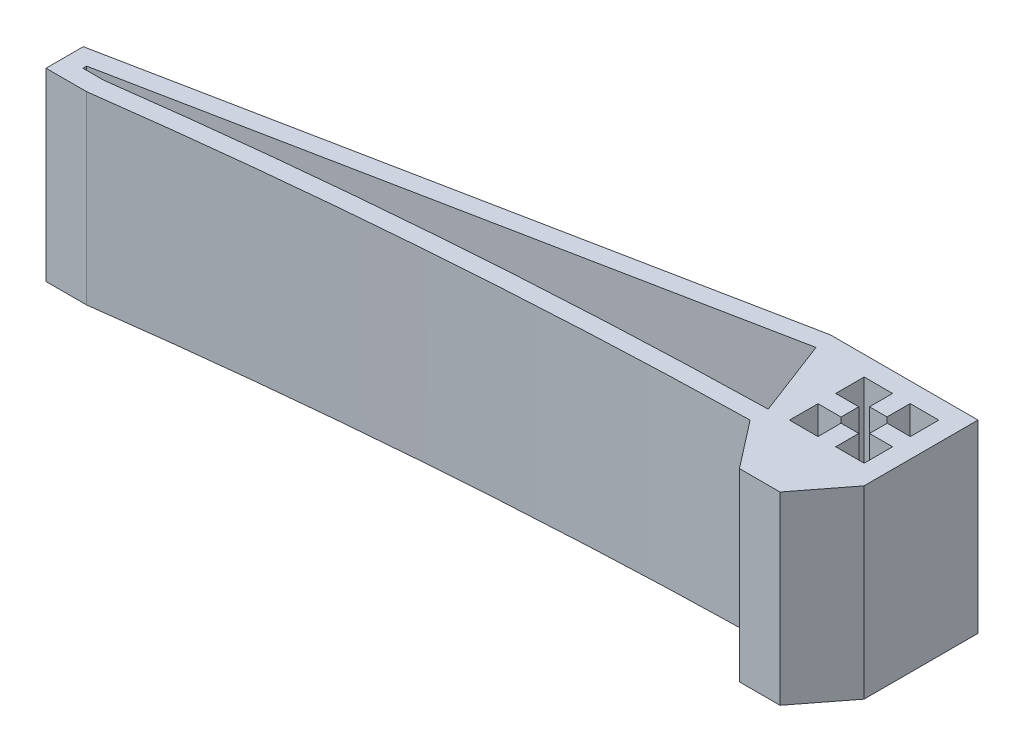
ISO-10303-21;
HEADER;
FILE_DESCRIPTION(('STEP AP214'),'2;1');
FILE_NAME('part.step','',(''),(''),'','','');
FILE_SCHEMA(('AUTOMOTIVE_DESIGN { 1 0 10303 214 1 1 1 1 }'));
ENDSEC;
DATA;
#1=APPLICATION_CONTEXT('core data for automotive mechanical design processes');
#2=APPLICATION_PROTOCOL_DEFINITION('international standard','automotive_design',2000,#1);
#3=PRODUCT_CONTEXT('',#1,'mechanical');
#4=PRODUCT('Part','Part','',(#3));
#5=PRODUCT_RELATED_PRODUCT_CATEGORY('part','',(#4));
#6=PRODUCT_DEFINITION_FORMATION('','',#4);
#7=PRODUCT_DEFINITION_CONTEXT('part definition',#1,'design');
#8=PRODUCT_DEFINITION('design','',#6,#7);
#9=PRODUCT_DEFINITION_SHAPE('','',#8);
#10=(LENGTH_UNIT() NAMED_UNIT(*) SI_UNIT(.MILLI.,.METRE.));
#11=(NAMED_UNIT(*) PLANE_ANGLE_UNIT() SI_UNIT($,.RADIAN.));
#12=(NAMED_UNIT(*) SI_UNIT($,.STERADIAN.) SOLID_ANGLE_UNIT());
#13=UNCERTAINTY_MEASURE_WITH_UNIT(LENGTH_MEASURE(1.E-05),#10,'distance_accuracy_value','');
#14=(GEOMETRIC_REPRESENTATION_CONTEXT(3) GLOBAL_UNCERTAINTY_ASSIGNED_CONTEXT((#13)) GLOBAL_UNIT_ASSIGNED_CONTEXT((#10,
#11,#12)) REPRESENTATION_CONTEXT('',''));
#15=CARTESIAN_POINT('',(0.,0.,0.));
#16=DIRECTION('',(0.,0.,1.));
#17=DIRECTION('',(1.,0.,0.));
#18=AXIS2_PLACEMENT_3D('',#15,#16,#17);
#19=CARTESIAN_POINT('',(-98.9690705210254,50.,19.4567414902959));
#20=DIRECTION('',(0.,1.,0.));
#21=DIRECTION('',(0.,0.,1.));
#22=AXIS2_PLACEMENT_3D('',#19,#20,#21);
#23=PLANE('',#22);
#24=CARTESIAN_POINT('',(-182.185114876448,50.,28.2346423573872));
#25=CARTESIAN_POINT('',(-99.1360168221978,50.,17.0865950202692));
#26=CARTESIAN_POINT('',(-15.419133563258,50.,15.419133563258));
#27=B_SPLINE_CURVE_WITH_KNOTS('',2,(#24,#25,#26),.UNSPECIFIED.,.F.,.F.,(3,3),(0.,1.),.UNSPECIFIED.);
#28=CARTESIAN_POINT('',(-182.185114876448,50.,28.2346423573872));
#29=VERTEX_POINT('',#28);
#30=CARTESIAN_POINT('',(-15.419133563258,50.,15.419133563258));
#31=VERTEX_POINT('',#30);
#32=EDGE_CURVE('E525',#29,#31,#27,.T.);
#33=ORIENTED_EDGE('',*,*,#32,.T.);
#34=DIRECTION('',(0.612556121082558,0.,0.790427098804368));
#35=VECTOR('',#34,1.);
#36=CARTESIAN_POINT('',(-5.48751764509717,50.,28.2346423573872));
#37=LINE('',#36,#35);
#38=CARTESIAN_POINT('',(-5.48751764509717,50.,28.2346423573872));
#39=VERTEX_POINT('',#38);
#40=EDGE_CURVE('E553',#31,#39,#37,.T.);
#41=ORIENTED_EDGE('',*,*,#40,.T.);
#42=DIRECTION('',(1.,0.,0.));
#43=VECTOR('',#42,1.);
#44=CARTESIAN_POINT('',(-5.48751764509717,50.,28.2346423573872));
#45=LINE('',#44,#43);
#46=CARTESIAN_POINT('',(5.48751764509718,50.,28.2346423573872));
#47=VERTEX_POINT('',#46);
#48=EDGE_CURVE('E504',#39,#47,#45,.T.);
#49=ORIENTED_EDGE('',*,*,#48,.T.);
#50=DIRECTION('',(0.612556121082558,0.,-0.790427098804368));
#51=VECTOR('',#50,1.);
#52=CARTESIAN_POINT('',(5.48751764509718,50.,28.2346423573872));
#53=LINE('',#52,#51);
#54=CARTESIAN_POINT('',(15.419133563258,50.,15.419133563258));
#55=VERTEX_POINT('',#54);
#56=EDGE_CURVE('E547',#47,#55,#53,.T.);
#57=ORIENTED_EDGE('',*,*,#56,.T.);
#58=DIRECTION('',(0.,0.,-1.));
#59=VECTOR('',#58,1.);
#60=CARTESIAN_POINT('',(15.419133563258,50.,15.419133563258));
#61=LINE('',#60,#59);
#62=CARTESIAN_POINT('',(15.419133563258,50.,-15.419133563258));
#63=VERTEX_POINT('',#62);
#64=EDGE_CURVE('E549',#55,#63,#61,.T.);
#65=ORIENTED_EDGE('',*,*,#64,.T.);
#66=DIRECTION('',(-1.,0.,0.));
#67=VECTOR('',#66,1.);
#68=CARTESIAN_POINT('',(15.419133563258,50.,-15.419133563258));
#69=LINE('',#68,#67);
#70=CARTESIAN_POINT('',(-24.494437672455,50.,-15.419133563258));
#71=VERTEX_POINT('',#70);
#72=EDGE_CURVE('E551',#63,#71,#69,.T.);
#73=ORIENTED_EDGE('',*,*,#72,.T.);
#74=DIRECTION('',(-0.980776783618294,0.,0.195133033378142));
#75=VECTOR('',#74,1.);
#76=CARTESIAN_POINT('',(-24.494437672455,50.,-15.419133563258));
#77=LINE('',#76,#75);
#78=CARTESIAN_POINT('',(-193.160150166642,50.,18.1381983960651));
#79=VERTEX_POINT('',#78);
#80=EDGE_CURVE('E558',#71,#79,#77,.T.);
#81=ORIENTED_EDGE('',*,*,#80,.T.);
#82=DIRECTION('',(0.,0.,1.));
#83=VECTOR('',#82,1.);
#84=CARTESIAN_POINT('',(-193.160150166642,50.,28.2346423573872));
#85=LINE('',#84,#83);
#86=CARTESIAN_POINT('',(-193.160150166642,50.,28.2346423573872));
#87=VERTEX_POINT('',#86);
#88=EDGE_CURVE('E560',#79,#87,#85,.T.);
#89=ORIENTED_EDGE('',*,*,#88,.T.);
#90=DIRECTION('',(1.,0.,0.));
#91=VECTOR('',#90,1.);
#92=CARTESIAN_POINT('',(-182.185114876448,50.,28.2346423573872));
#93=LINE('',#92,#91);
#94=EDGE_CURVE('E530',#87,#29,#93,.T.);
#95=ORIENTED_EDGE('',*,*,#94,.T.);
#96=EDGE_LOOP('',(#33,#41,#49,#57,#65,#73,#81,#89,#95));
#97=FACE_BOUND('',#96,.T.);
#98=DIRECTION('',(-0.980776783618293,0.,0.195133033378142));
#99=VECTOR('',#98,1.);
#100=CARTESIAN_POINT('',(-23.5187725055643,50.,-10.5152496451666));
#101=LINE('',#100,#99);
#102=CARTESIAN_POINT('',(-23.5187725055643,50.,-10.5152496451666));
#103=VERTEX_POINT('',#102);
#104=CARTESIAN_POINT('',(-188.160150166642,50.,22.2414101567093));
#105=VERTEX_POINT('',#104);
#106=EDGE_CURVE('E408',#103,#105,#101,.T.);
#107=ORIENTED_EDGE('',*,*,#106,.F.);
#108=DIRECTION('',(-0.356957116026224,0.,-0.934120772340622));
#109=VECTOR('',#108,1.);
#110=CARTESIAN_POINT('',(-15.5187031322485,50.,10.4201250714738));
#111=LINE('',#110,#109);
#112=CARTESIAN_POINT('',(-15.5187031322485,50.,10.4201250714738));
#113=VERTEX_POINT('',#112);
#114=EDGE_CURVE('E406',#113,#103,#111,.T.);
#115=ORIENTED_EDGE('',*,*,#114,.F.);
#116=CARTESIAN_POINT('',(-182.518919813248,50.,23.2346423573951));
#117=CARTESIAN_POINT('',(-99.352804625768,50.,12.0899455037888));
#118=CARTESIAN_POINT('',(-15.5187031322485,50.,10.4201250714738));
#119=B_SPLINE_CURVE_WITH_KNOTS('',2,(#116,#117,#118),.UNSPECIFIED.,.F.,.F.,(3,3),
(0.00198847837220901,1.),.UNSPECIFIED.);
#120=CARTESIAN_POINT('',(-182.518919813248,50.,23.2346423573951));
#121=VERTEX_POINT('',#120);
#122=EDGE_CURVE('E416',#121,#113,#119,.T.);
#123=ORIENTED_EDGE('',*,*,#122,.F.);
#124=DIRECTION('',(1.,0.,1.3979313780451E-12));
#125=VECTOR('',#124,1.);
#126=CARTESIAN_POINT('',(-182.518919813248,50.,23.2346423573951));
#127=LINE('',#126,#125);
#128=CARTESIAN_POINT('',(-188.160150166642,50.,23.2346423573872));
#129=VERTEX_POINT('',#128);
#130=EDGE_CURVE('E413',#129,#121,#127,.T.);
#131=ORIENTED_EDGE('',*,*,#130,.F.);
#132=DIRECTION('',(0.,0.,1.));
#133=VECTOR('',#132,1.);
#134=CARTESIAN_POINT('',(-188.160150166642,50.,23.2346423573872));
#135=LINE('',#134,#133);
#136=EDGE_CURVE('E411',#105,#129,#135,.T.);
#137=ORIENTED_EDGE('',*,*,#136,.F.);
#138=EDGE_LOOP('',(#107,#115,#123,#131,#137));
#139=FACE_BOUND('',#138,.T.);
#140=DIRECTION('',(1.,0.,0.));
#141=VECTOR('',#140,1.);
#142=CARTESIAN_POINT('',(-10.0735773270664,50.,-2.4));
#143=LINE('',#142,#141);
#144=CARTESIAN_POINT('',(-10.0735773270664,50.,-2.4));
#145=VERTEX_POINT('',#144);
#146=CARTESIAN_POINT('',(-3.82357732706653,50.,-2.4));
#147=VERTEX_POINT('',#146);
#148=EDGE_CURVE('E265',#145,#147,#143,.T.);
#149=ORIENTED_EDGE('',*,*,#148,.F.);
#150=DIRECTION('',(0.,0.,1.));
#151=VECTOR('',#150,1.);
#152=CARTESIAN_POINT('',(-10.0735773270664,50.,-2.4));
#153=LINE('',#152,#151);
#154=CARTESIAN_POINT('',(-10.0735773270664,50.,-10.0999999999999));
#155=VERTEX_POINT('',#154);
#156=EDGE_CURVE('E257',#155,#145,#153,.T.);
#157=ORIENTED_EDGE('',*,*,#156,.F.);
#158=DIRECTION('',(-1.,0.,0.));
#159=VECTOR('',#158,1.);
#160=CARTESIAN_POINT('',(-10.0735773270664,50.,-10.0999999999999));
#161=LINE('',#160,#159);
#162=CARTESIAN_POINT('',(-2.37357732706651,50.,-10.0999999999999));
#163=VERTEX_POINT('',#162);
#164=EDGE_CURVE('E314',#163,#155,#161,.T.);
#165=ORIENTED_EDGE('',*,*,#164,.F.);
#166=DIRECTION('',(0.,0.,-1.));
#167=VECTOR('',#166,1.);
#168=CARTESIAN_POINT('',(-2.37357732706652,50.,-10.0999999999999));
#169=LINE('',#168,#167);
#170=CARTESIAN_POINT('',(-2.37357732706652,50.,-3.85));
#171=VERTEX_POINT('',#170);
#172=EDGE_CURVE('E312',#171,#163,#169,.T.);
#173=ORIENTED_EDGE('',*,*,#172,.F.);
#174=DIRECTION('',(-1.,0.,0.));
#175=VECTOR('',#174,1.);
#176=CARTESIAN_POINT('',(-2.37357732706652,50.,-3.85));
#177=LINE('',#176,#175);
#178=CARTESIAN_POINT('',(2.37357732706652,50.,-3.85));
#179=VERTEX_POINT('',#178);
#180=EDGE_CURVE('E310',#179,#171,#177,.T.);
#181=ORIENTED_EDGE('',*,*,#180,.F.);
#182=DIRECTION('',(0.,0.,1.));
#183=VECTOR('',#182,1.);
#184=CARTESIAN_POINT('',(2.37357732706652,50.,-3.85));
#185=LINE('',#184,#183);
#186=CARTESIAN_POINT('',(2.37357732706652,50.,-10.0999999999999));
#187=VERTEX_POINT('',#186);
#188=EDGE_CURVE('E308',#187,#179,#185,.T.);
#189=ORIENTED_EDGE('',*,*,#188,.F.);
#190=DIRECTION('',(-1.,0.,0.));
#191=VECTOR('',#190,1.);
#192=CARTESIAN_POINT('',(2.37357732706652,50.,-10.0999999999999));
#193=LINE('',#192,#191);
#194=CARTESIAN_POINT('',(10.1264226729335,50.,-10.0999999999999));
#195=VERTEX_POINT('',#194);
#196=EDGE_CURVE('E306',#195,#187,#193,.T.);
#197=ORIENTED_EDGE('',*,*,#196,.F.);
#198=DIRECTION('',(0.,0.,-1.));
#199=VECTOR('',#198,1.);
#200=CARTESIAN_POINT('',(10.1264226729335,50.,-10.0999999999999));
#201=LINE('',#200,#199);
#202=CARTESIAN_POINT('',(10.1264226729335,50.,-2.4));
#203=VERTEX_POINT('',#202);
#204=EDGE_CURVE('E304',#203,#195,#201,.T.);
#205=ORIENTED_EDGE('',*,*,#204,.F.);
#206=DIRECTION('',(1.,0.,0.));
#207=VECTOR('',#206,1.);
#208=CARTESIAN_POINT('',(10.1264226729335,50.,-2.4));
#209=LINE('',#208,#207);
#210=CARTESIAN_POINT('',(3.87642267293347,50.,-2.4));
#211=VERTEX_POINT('',#210);
#212=EDGE_CURVE('E302',#211,#203,#209,.T.);
#213=ORIENTED_EDGE('',*,*,#212,.F.);
#214=DIRECTION('',(0.,0.,-1.));
#215=VECTOR('',#214,1.);
#216=CARTESIAN_POINT('',(3.87642267293347,50.,2.4));
#217=LINE('',#216,#215);
#218=CARTESIAN_POINT('',(3.87642267293347,50.,2.4));
#219=VERTEX_POINT('',#218);
#220=EDGE_CURVE('E300',#219,#211,#217,.T.);
#221=ORIENTED_EDGE('',*,*,#220,.F.);
#222=DIRECTION('',(-1.,0.,0.));
#223=VECTOR('',#222,1.);
#224=CARTESIAN_POINT('',(10.1264226729334,50.,2.4));
#225=LINE('',#224,#223);
#226=CARTESIAN_POINT('',(10.1264226729334,50.,2.4));
#227=VERTEX_POINT('',#226);
#228=EDGE_CURVE('E298',#227,#219,#225,.T.);
#229=ORIENTED_EDGE('',*,*,#228,.F.);
#230=DIRECTION('',(0.,0.,-1.));
#231=VECTOR('',#230,1.);
#232=CARTESIAN_POINT('',(10.1264226729334,50.,10.1));
#233=LINE('',#232,#231);
#234=CARTESIAN_POINT('',(10.1264226729334,50.,10.1));
#235=VERTEX_POINT('',#234);
#236=EDGE_CURVE('E296',#235,#227,#233,.T.);
#237=ORIENTED_EDGE('',*,*,#236,.F.);
#238=DIRECTION('',(1.,0.,0.));
#239=VECTOR('',#238,1.);
#240=CARTESIAN_POINT('',(2.42642267293348,50.,10.1));
#241=LINE('',#240,#239);
#242=CARTESIAN_POINT('',(2.42642267293348,50.,10.1));
#243=VERTEX_POINT('',#242);
#244=EDGE_CURVE('E294',#243,#235,#241,.T.);
#245=ORIENTED_EDGE('',*,*,#244,.F.);
#246=DIRECTION('',(0.,0.,1.));
#247=VECTOR('',#246,1.);
#248=CARTESIAN_POINT('',(2.42642267293348,50.,3.85));
#249=LINE('',#248,#247);
#250=CARTESIAN_POINT('',(2.42642267293348,50.,3.85));
#251=VERTEX_POINT('',#250);
#252=EDGE_CURVE('E292',#251,#243,#249,.T.);
#253=ORIENTED_EDGE('',*,*,#252,.F.);
#254=DIRECTION('',(1.,0.,0.));
#255=VECTOR('',#254,1.);
#256=CARTESIAN_POINT('',(-2.37357732706649,50.,3.85));
#257=LINE('',#256,#255);
#258=CARTESIAN_POINT('',(-2.37357732706649,50.,3.85));
#259=VERTEX_POINT('',#258);
#260=EDGE_CURVE('E290',#259,#251,#257,.T.);
#261=ORIENTED_EDGE('',*,*,#260,.F.);
#262=DIRECTION('',(0.,0.,-1.));
#263=VECTOR('',#262,1.);
#264=CARTESIAN_POINT('',(-2.37357732706649,50.,10.0999999999999));
#265=LINE('',#264,#263);
#266=CARTESIAN_POINT('',(-2.37357732706649,50.,10.0999999999999));
#267=VERTEX_POINT('',#266);
#268=EDGE_CURVE('E288',#267,#259,#265,.T.);
#269=ORIENTED_EDGE('',*,*,#268,.F.);
#270=DIRECTION('',(1.,0.,0.));
#271=VECTOR('',#270,1.);
#272=CARTESIAN_POINT('',(-10.0735773270665,50.,10.0999999999999));
#273=LINE('',#272,#271);
#274=CARTESIAN_POINT('',(-10.0735773270665,50.,10.0999999999999));
#275=VERTEX_POINT('',#274);
#276=EDGE_CURVE('E286',#275,#267,#273,.T.);
#277=ORIENTED_EDGE('',*,*,#276,.F.);
#278=DIRECTION('',(0.,0.,1.));
#279=VECTOR('',#278,1.);
#280=CARTESIAN_POINT('',(-10.0735773270665,50.,2.4));
#281=LINE('',#280,#279);
#282=CARTESIAN_POINT('',(-10.0735773270665,50.,2.4));
#283=VERTEX_POINT('',#282);
#284=EDGE_CURVE('E284',#283,#275,#281,.T.);
#285=ORIENTED_EDGE('',*,*,#284,.F.);
#286=DIRECTION('',(-1.,0.,0.));
#287=VECTOR('',#286,1.);
#288=CARTESIAN_POINT('',(-3.82357732706652,50.,2.4));
#289=LINE('',#288,#287);
#290=CARTESIAN_POINT('',(-3.82357732706652,50.,2.4));
#291=VERTEX_POINT('',#290);
#292=EDGE_CURVE('E280',#291,#283,#289,.T.);
#293=ORIENTED_EDGE('',*,*,#292,.F.);
#294=DIRECTION('',(0.,0.,1.));
#295=VECTOR('',#294,1.);
#296=CARTESIAN_POINT('',(-3.82357732706653,50.,-2.4));
#297=LINE('',#296,#295);
#298=EDGE_CURVE('E278',#147,#291,#297,.T.);
#299=ORIENTED_EDGE('',*,*,#298,.F.);
#300=EDGE_LOOP('',(#149,#157,#165,#173,#181,#189,#197,#205,#213,#221,#229,#237,#245,#253,#261,
#269,#277,#285,#293,#299));
#301=FACE_BOUND('',#300,.T.);
#302=ADVANCED_FACE('F35',(#97,#139,#301),#23,.T.);
#303=CARTESIAN_POINT('',(-98.9690705210254,0.,19.4567414902959));
#304=DIRECTION('',(0.,1.,0.));
#305=DIRECTION('',(0.,0.,1.));
#306=AXIS2_PLACEMENT_3D('',#303,#304,#305);
#307=PLANE('',#306);
#308=DIRECTION('',(-0.356957116026224,0.,-0.934120772340622));
#309=VECTOR('',#308,1.);
#310=CARTESIAN_POINT('',(-15.5187031322485,0.,10.4201250714738));
#311=LINE('',#310,#309);
#312=CARTESIAN_POINT('',(-15.5187031322485,0.,10.4201250714738));
#313=VERTEX_POINT('',#312);
#314=CARTESIAN_POINT('',(-23.5187725055643,0.,-10.5152496451666));
#315=VERTEX_POINT('',#314);
#316=EDGE_CURVE('E273',#313,#315,#311,.T.);
#317=ORIENTED_EDGE('',*,*,#316,.T.);
#318=DIRECTION('',(-0.980776783618293,0.,0.195133033378142));
#319=VECTOR('',#318,1.);
#320=CARTESIAN_POINT('',(-23.5187725055643,0.,-10.5152496451666));
#321=LINE('',#320,#319);
#322=CARTESIAN_POINT('',(-188.160150166642,0.,22.2414101567093));
#323=VERTEX_POINT('',#322);
#324=EDGE_CURVE('E611',#315,#323,#321,.T.);
#325=ORIENTED_EDGE('',*,*,#324,.T.);
#326=DIRECTION('',(0.,0.,1.));
#327=VECTOR('',#326,1.);
#328=CARTESIAN_POINT('',(-188.160150166642,0.,23.2346423573872));
#329=LINE('',#328,#327);
#330=CARTESIAN_POINT('',(-188.160150166642,0.,23.2346423573872));
#331=VERTEX_POINT('',#330);
#332=EDGE_CURVE('E606',#323,#331,#329,.T.);
#333=ORIENTED_EDGE('',*,*,#332,.T.);
#334=DIRECTION('',(1.,0.,1.3979313780451E-12));
#335=VECTOR('',#334,1.);
#336=CARTESIAN_POINT('',(-182.518919813248,0.,23.2346423573951));
#337=LINE('',#336,#335);
#338=CARTESIAN_POINT('',(-182.518919813248,0.,23.2346423573951));
#339=VERTEX_POINT('',#338);
#340=EDGE_CURVE('E610',#331,#339,#337,.T.);
#341=ORIENTED_EDGE('',*,*,#340,.T.);
#342=CARTESIAN_POINT('',(-182.518919813248,0.,23.2346423573951));
#343=CARTESIAN_POINT('',(-99.352804625768,0.,12.0899455037888));
#344=CARTESIAN_POINT('',(-15.5187031322485,0.,10.4201250714738));
#345=B_SPLINE_CURVE_WITH_KNOTS('',2,(#342,#343,#344),.UNSPECIFIED.,.F.,.F.,(3,3),
(0.00198847837220901,1.),.UNSPECIFIED.);
#346=EDGE_CURVE('E409',#339,#313,#345,.T.);
#347=ORIENTED_EDGE('',*,*,#346,.T.);
#348=EDGE_LOOP('',(#317,#325,#333,#341,#347));
#349=FACE_BOUND('',#348,.T.);
#350=CARTESIAN_POINT('',(-182.185114876448,0.,28.2346423573872));
#351=CARTESIAN_POINT('',(-99.1360168221978,0.,17.0865950202692));
#352=CARTESIAN_POINT('',(-15.419133563258,0.,15.419133563258));
#353=B_SPLINE_CURVE_WITH_KNOTS('',2,(#350,#351,#352),.UNSPECIFIED.,.F.,.F.,(3,3),(0.,1.),.UNSPECIFIED.);
#354=CARTESIAN_POINT('',(-182.185114876448,0.,28.2346423573872));
#355=VERTEX_POINT('',#354);
#356=CARTESIAN_POINT('',(-15.419133563258,0.,15.419133563258));
#357=VERTEX_POINT('',#356);
#358=EDGE_CURVE('E500',#355,#357,#353,.T.);
#359=ORIENTED_EDGE('',*,*,#358,.F.);
#360=DIRECTION('',(1.,0.,0.));
#361=VECTOR('',#360,1.);
#362=CARTESIAN_POINT('',(-182.185114876448,0.,28.2346423573872));
#363=LINE('',#362,#361);
#364=CARTESIAN_POINT('',(-193.160150166642,0.,28.2346423573872));
#365=VERTEX_POINT('',#364);
#366=EDGE_CURVE('E523',#365,#355,#363,.T.);
#367=ORIENTED_EDGE('',*,*,#366,.F.);
#368=DIRECTION('',(0.,0.,1.));
#369=VECTOR('',#368,1.);
#370=CARTESIAN_POINT('',(-193.160150166642,0.,28.2346423573872));
#371=LINE('',#370,#369);
#372=CARTESIAN_POINT('',(-193.160150166642,0.,18.1381983960651));
#373=VERTEX_POINT('',#372);
#374=EDGE_CURVE('E521',#373,#365,#371,.T.);
#375=ORIENTED_EDGE('',*,*,#374,.F.);
#376=DIRECTION('',(-0.980776783618294,0.,0.195133033378142));
#377=VECTOR('',#376,1.);
#378=CARTESIAN_POINT('',(-24.494437672455,0.,-15.419133563258));
#379=LINE('',#378,#377);
#380=CARTESIAN_POINT('',(-24.494437672455,0.,-15.419133563258));
#381=VERTEX_POINT('',#380);
#382=EDGE_CURVE('E519',#381,#373,#379,.T.);
#383=ORIENTED_EDGE('',*,*,#382,.F.);
#384=DIRECTION('',(-1.,0.,0.));
#385=VECTOR('',#384,1.);
#386=CARTESIAN_POINT('',(-15.419133563258,0.,-15.419133563258));
#387=LINE('',#386,#385);
#388=CARTESIAN_POINT('',(15.419133563258,0.,-15.419133563258));
#389=VERTEX_POINT('',#388);
#390=EDGE_CURVE('E517',#389,#381,#387,.T.);
#391=ORIENTED_EDGE('',*,*,#390,.F.);
#392=DIRECTION('',(0.,0.,-1.));
#393=VECTOR('',#392,1.);
#394=CARTESIAN_POINT('',(15.419133563258,0.,15.419133563258));
#395=LINE('',#394,#393);
#396=CARTESIAN_POINT('',(15.419133563258,0.,15.419133563258));
#397=VERTEX_POINT('',#396);
#398=EDGE_CURVE('E511',#397,#389,#395,.T.);
#399=ORIENTED_EDGE('',*,*,#398,.F.);
#400=DIRECTION('',(0.612556121082558,0.,-0.790427098804368));
#401=VECTOR('',#400,1.);
#402=CARTESIAN_POINT('',(5.48751764509718,0.,28.2346423573872));
#403=LINE('',#402,#401);
#404=CARTESIAN_POINT('',(5.48751764509718,0.,28.2346423573872));
#405=VERTEX_POINT('',#404);
#406=EDGE_CURVE('E509',#405,#397,#403,.T.);
#407=ORIENTED_EDGE('',*,*,#406,.F.);
#408=DIRECTION('',(1.,0.,0.));
#409=VECTOR('',#408,1.);
#410=CARTESIAN_POINT('',(-5.48751764509717,0.,28.2346423573872));
#411=LINE('',#410,#409);
#412=CARTESIAN_POINT('',(-5.48751764509717,0.,28.2346423573872));
#413=VERTEX_POINT('',#412);
#414=EDGE_CURVE('E499',#413,#405,#411,.T.);
#415=ORIENTED_EDGE('',*,*,#414,.F.);
#416=DIRECTION('',(0.612556121082558,0.,0.790427098804368));
#417=VECTOR('',#416,1.);
#418=CARTESIAN_POINT('',(-5.48751764509717,0.,28.2346423573872));
#419=LINE('',#418,#417);
#420=EDGE_CURVE('E491',#357,#413,#419,.T.);
#421=ORIENTED_EDGE('',*,*,#420,.F.);
#422=EDGE_LOOP('',(#359,#367,#375,#383,#391,#399,#407,#415,#421));
#423=FACE_BOUND('',#422,.T.);
#424=DIRECTION('',(0.,0.,1.));
#425=VECTOR('',#424,1.);
#426=CARTESIAN_POINT('',(-10.0735773270664,0.,-2.4));
#427=LINE('',#426,#425);
#428=CARTESIAN_POINT('',(-10.0735773270664,0.,-10.0999999999999));
#429=VERTEX_POINT('',#428);
#430=CARTESIAN_POINT('',(-10.0735773270664,0.,-2.4));
#431=VERTEX_POINT('',#430);
#432=EDGE_CURVE('E59',#429,#431,#427,.T.);
#433=ORIENTED_EDGE('',*,*,#432,.T.);
#434=DIRECTION('',(1.,0.,0.));
#435=VECTOR('',#434,1.);
#436=CARTESIAN_POINT('',(-10.0735773270664,0.,-2.4));
#437=LINE('',#436,#435);
#438=CARTESIAN_POINT('',(-3.82357732706653,0.,-2.4));
#439=VERTEX_POINT('',#438);
#440=EDGE_CURVE('E272',#431,#439,#437,.T.);
#441=ORIENTED_EDGE('',*,*,#440,.T.);
#442=DIRECTION('',(0.,0.,1.));
#443=VECTOR('',#442,1.);
#444=CARTESIAN_POINT('',(-3.82357732706653,0.,-2.4));
#445=LINE('',#444,#443);
#446=CARTESIAN_POINT('',(-3.82357732706652,0.,2.4));
#447=VERTEX_POINT('',#446);
#448=EDGE_CURVE('E318',#439,#447,#445,.T.);
#449=ORIENTED_EDGE('',*,*,#448,.T.);
#450=DIRECTION('',(-1.,0.,0.));
#451=VECTOR('',#450,1.);
#452=CARTESIAN_POINT('',(-3.82357732706652,0.,2.4));
#453=LINE('',#452,#451);
#454=CARTESIAN_POINT('',(-10.0735773270665,0.,2.4));
#455=VERTEX_POINT('',#454);
#456=EDGE_CURVE('E321',#447,#455,#453,.T.);
#457=ORIENTED_EDGE('',*,*,#456,.T.);
#458=DIRECTION('',(0.,0.,1.));
#459=VECTOR('',#458,1.);
#460=CARTESIAN_POINT('',(-10.0735773270665,0.,2.4));
#461=LINE('',#460,#459);
#462=CARTESIAN_POINT('',(-10.0735773270665,0.,10.0999999999999));
#463=VERTEX_POINT('',#462);
#464=EDGE_CURVE('E324',#455,#463,#461,.T.);
#465=ORIENTED_EDGE('',*,*,#464,.T.);
#466=DIRECTION('',(1.,0.,0.));
#467=VECTOR('',#466,1.);
#468=CARTESIAN_POINT('',(-10.0735773270665,0.,10.0999999999999));
#469=LINE('',#468,#467);
#470=CARTESIAN_POINT('',(-2.37357732706649,0.,10.0999999999999));
#471=VERTEX_POINT('',#470);
#472=EDGE_CURVE('E327',#463,#471,#469,.T.);
#473=ORIENTED_EDGE('',*,*,#472,.T.);
#474=DIRECTION('',(0.,0.,-1.));
#475=VECTOR('',#474,1.);
#476=CARTESIAN_POINT('',(-2.37357732706649,0.,10.0999999999999));
#477=LINE('',#476,#475);
#478=CARTESIAN_POINT('',(-2.37357732706649,0.,3.85));
#479=VERTEX_POINT('',#478);
#480=EDGE_CURVE('E330',#471,#479,#477,.T.);
#481=ORIENTED_EDGE('',*,*,#480,.T.);
#482=DIRECTION('',(1.,0.,0.));
#483=VECTOR('',#482,1.);
#484=CARTESIAN_POINT('',(-2.37357732706649,0.,3.85));
#485=LINE('',#484,#483);
#486=CARTESIAN_POINT('',(2.42642267293348,0.,3.85));
#487=VERTEX_POINT('',#486);
#488=EDGE_CURVE('E333',#479,#487,#485,.T.);
#489=ORIENTED_EDGE('',*,*,#488,.T.);
#490=DIRECTION('',(0.,0.,1.));
#491=VECTOR('',#490,1.);
#492=CARTESIAN_POINT('',(2.42642267293348,0.,3.85));
#493=LINE('',#492,#491);
#494=CARTESIAN_POINT('',(2.42642267293348,0.,10.1));
#495=VERTEX_POINT('',#494);
#496=EDGE_CURVE('E336',#487,#495,#493,.T.);
#497=ORIENTED_EDGE('',*,*,#496,.T.);
#498=DIRECTION('',(1.,0.,0.));
#499=VECTOR('',#498,1.);
#500=CARTESIAN_POINT('',(2.42642267293348,0.,10.1));
#501=LINE('',#500,#499);
#502=CARTESIAN_POINT('',(10.1264226729334,0.,10.1));
#503=VERTEX_POINT('',#502);
#504=EDGE_CURVE('E339',#495,#503,#501,.T.);
#505=ORIENTED_EDGE('',*,*,#504,.T.);
#506=DIRECTION('',(0.,0.,-1.));
#507=VECTOR('',#506,1.);
#508=CARTESIAN_POINT('',(10.1264226729334,0.,10.1));
#509=LINE('',#508,#507);
#510=CARTESIAN_POINT('',(10.1264226729334,0.,2.4));
#511=VERTEX_POINT('',#510);
#512=EDGE_CURVE('E342',#503,#511,#509,.T.);
#513=ORIENTED_EDGE('',*,*,#512,.T.);
#514=DIRECTION('',(-1.,0.,0.));
#515=VECTOR('',#514,1.);
#516=CARTESIAN_POINT('',(10.1264226729334,0.,2.4));
#517=LINE('',#516,#515);
#518=CARTESIAN_POINT('',(3.87642267293347,0.,2.4));
#519=VERTEX_POINT('',#518);
#520=EDGE_CURVE('E345',#511,#519,#517,.T.);
#521=ORIENTED_EDGE('',*,*,#520,.T.);
#522=DIRECTION('',(0.,0.,-1.));
#523=VECTOR('',#522,1.);
#524=CARTESIAN_POINT('',(3.87642267293347,0.,2.4));
#525=LINE('',#524,#523);
#526=CARTESIAN_POINT('',(3.87642267293347,0.,-2.4));
#527=VERTEX_POINT('',#526);
#528=EDGE_CURVE('E348',#519,#527,#525,.T.);
#529=ORIENTED_EDGE('',*,*,#528,.T.);
#530=DIRECTION('',(1.,0.,0.));
#531=VECTOR('',#530,1.);
#532=CARTESIAN_POINT('',(10.1264226729335,0.,-2.4));
#533=LINE('',#532,#531);
#534=CARTESIAN_POINT('',(10.1264226729335,0.,-2.4));
#535=VERTEX_POINT('',#534);
#536=EDGE_CURVE('E351',#527,#535,#533,.T.);
#537=ORIENTED_EDGE('',*,*,#536,.T.);
#538=DIRECTION('',(0.,0.,-1.));
#539=VECTOR('',#538,1.);
#540=CARTESIAN_POINT('',(10.1264226729335,0.,-10.0999999999999));
#541=LINE('',#540,#539);
#542=CARTESIAN_POINT('',(10.1264226729335,0.,-10.0999999999999));
#543=VERTEX_POINT('',#542);
#544=EDGE_CURVE('E354',#535,#543,#541,.T.);
#545=ORIENTED_EDGE('',*,*,#544,.T.);
#546=DIRECTION('',(-1.,0.,0.));
#547=VECTOR('',#546,1.);
#548=CARTESIAN_POINT('',(2.37357732706652,0.,-10.0999999999999));
#549=LINE('',#548,#547);
#550=CARTESIAN_POINT('',(2.37357732706652,0.,-10.0999999999999));
#551=VERTEX_POINT('',#550);
#552=EDGE_CURVE('E357',#543,#551,#549,.T.);
#553=ORIENTED_EDGE('',*,*,#552,.T.);
#554=DIRECTION('',(0.,0.,1.));
#555=VECTOR('',#554,1.);
#556=CARTESIAN_POINT('',(2.37357732706652,0.,-3.85));
#557=LINE('',#556,#555);
#558=CARTESIAN_POINT('',(2.37357732706652,0.,-3.85));
#559=VERTEX_POINT('',#558);
#560=EDGE_CURVE('E360',#551,#559,#557,.T.);
#561=ORIENTED_EDGE('',*,*,#560,.T.);
#562=DIRECTION('',(-1.,0.,0.));
#563=VECTOR('',#562,1.);
#564=CARTESIAN_POINT('',(-2.37357732706652,0.,-3.85));
#565=LINE('',#564,#563);
#566=CARTESIAN_POINT('',(-2.37357732706652,0.,-3.85));
#567=VERTEX_POINT('',#566);
#568=EDGE_CURVE('E363',#559,#567,#565,.T.);
#569=ORIENTED_EDGE('',*,*,#568,.T.);
#570=DIRECTION('',(0.,0.,-1.));
#571=VECTOR('',#570,1.);
#572=CARTESIAN_POINT('',(-2.37357732706652,0.,-10.0999999999999));
#573=LINE('',#572,#571);
#574=CARTESIAN_POINT('',(-2.37357732706652,0.,-10.0999999999999));
#575=VERTEX_POINT('',#574);
#576=EDGE_CURVE('E366',#567,#575,#573,.T.);
#577=ORIENTED_EDGE('',*,*,#576,.T.);
#578=DIRECTION('',(-1.,0.,0.));
#579=VECTOR('',#578,1.);
#580=CARTESIAN_POINT('',(-10.0735773270664,0.,-10.0999999999999));
#581=LINE('',#580,#579);
#582=EDGE_CURVE('E266',#575,#429,#581,.T.);
#583=ORIENTED_EDGE('',*,*,#582,.T.);
#584=EDGE_LOOP('',(#433,#441,#449,#457,#465,#473,#481,#489,#497,#505,#513,#521,#529,#537,#545,
#553,#561,#569,#577,#583));
#585=FACE_BOUND('',#584,.T.);
#586=ADVANCED_FACE('F452',(#349,#423,#585),#307,.F.);
#587=DIRECTION('',(0.,-1.,0.));
#588=VECTOR('',#587,1.);
#589=SURFACE_OF_LINEAR_EXTRUSION('',#27,#588);
#590=ORIENTED_EDGE('',*,*,#358,.T.);
#591=DIRECTION('',(0.,-1.,0.));
#592=VECTOR('',#591,1.);
#593=CARTESIAN_POINT('',(-15.419133563258,50.,15.419133563258));
#594=LINE('',#593,#592);
#595=EDGE_CURVE('E11',#31,#357,#594,.T.);
#596=ORIENTED_EDGE('',*,*,#595,.F.);
#597=ORIENTED_EDGE('',*,*,#32,.F.);
#598=DIRECTION('',(0.,-1.,0.));
#599=VECTOR('',#598,1.);
#600=CARTESIAN_POINT('',(-182.185114876448,50.,28.2346423573872));
#601=LINE('',#600,#599);
#602=EDGE_CURVE('E526',#29,#355,#601,.T.);
#603=ORIENTED_EDGE('',*,*,#602,.T.);
#604=EDGE_LOOP('',(#590,#596,#597,#603));
#605=FACE_BOUND('',#604,.T.);
#606=ADVANCED_FACE('F37',(#605),#589,.F.);
#607=CARTESIAN_POINT('',(-5.48751764509717,50.,28.2346423573872));
#608=DIRECTION('',(0.790427098804368,0.,-0.612556121082558));
#609=DIRECTION('',(-0.612556121082558,0.,-0.790427098804368));
#610=AXIS2_PLACEMENT_3D('',#607,#608,#609);
#611=PLANE('',#610);
#612=ORIENTED_EDGE('',*,*,#420,.T.);
#613=DIRECTION('',(0.,-1.,0.));
#614=VECTOR('',#613,1.);
#615=CARTESIAN_POINT('',(-5.48751764509717,50.,28.2346423573872));
#616=LINE('',#615,#614);
#617=EDGE_CURVE('E44',#39,#413,#616,.T.);
#618=ORIENTED_EDGE('',*,*,#617,.F.);
#619=ORIENTED_EDGE('',*,*,#40,.F.);
#620=ORIENTED_EDGE('',*,*,#595,.T.);
#621=EDGE_LOOP('',(#612,#618,#619,#620));
#622=FACE_BOUND('',#621,.T.);
#623=ADVANCED_FACE('F482',(#622),#611,.F.);
#624=CARTESIAN_POINT('',(-5.48751764509717,50.,28.2346423573872));
#625=DIRECTION('',(0.,0.,-1.));
#626=DIRECTION('',(-1.,0.,0.));
#627=AXIS2_PLACEMENT_3D('',#624,#625,#626);
#628=PLANE('',#627);
#629=ORIENTED_EDGE('',*,*,#414,.T.);
#630=DIRECTION('',(0.,-1.,0.));
#631=VECTOR('',#630,1.);
#632=CARTESIAN_POINT('',(5.48751764509718,50.,28.2346423573872));
#633=LINE('',#632,#631);
#634=EDGE_CURVE('E505',#47,#405,#633,.T.);
#635=ORIENTED_EDGE('',*,*,#634,.F.);
#636=ORIENTED_EDGE('',*,*,#48,.F.);
#637=ORIENTED_EDGE('',*,*,#617,.T.);
#638=EDGE_LOOP('',(#629,#635,#636,#637));
#639=FACE_BOUND('',#638,.T.);
#640=ADVANCED_FACE('F479',(#639),#628,.F.);
#641=CARTESIAN_POINT('',(5.48751764509718,50.,28.2346423573872));
#642=DIRECTION('',(-0.790427098804368,0.,-0.612556121082558));
#643=DIRECTION('',(-0.612556121082558,0.,0.790427098804368));
#644=AXIS2_PLACEMENT_3D('',#641,#642,#643);
#645=PLANE('',#644);
#646=ORIENTED_EDGE('',*,*,#406,.T.);
#647=DIRECTION('',(0.,-1.,0.));
#648=VECTOR('',#647,1.);
#649=CARTESIAN_POINT('',(15.419133563258,50.,15.419133563258));
#650=LINE('',#649,#648);
#651=EDGE_CURVE('E542',#55,#397,#650,.T.);
#652=ORIENTED_EDGE('',*,*,#651,.F.);
#653=ORIENTED_EDGE('',*,*,#56,.F.);
#654=ORIENTED_EDGE('',*,*,#634,.T.);
#655=EDGE_LOOP('',(#646,#652,#653,#654));
#656=FACE_BOUND('',#655,.T.);
#657=ADVANCED_FACE('F475',(#656),#645,.F.);
#658=CARTESIAN_POINT('',(15.419133563258,50.,15.419133563258));
#659=DIRECTION('',(-1.,0.,0.));
#660=DIRECTION('',(0.,0.,1.));
#661=AXIS2_PLACEMENT_3D('',#658,#659,#660);
#662=PLANE('',#661);
#663=ORIENTED_EDGE('',*,*,#398,.T.);
#664=DIRECTION('',(0.,-1.,0.));
#665=VECTOR('',#664,1.);
#666=CARTESIAN_POINT('',(15.419133563258,50.,-15.419133563258));
#667=LINE('',#666,#665);
#668=EDGE_CURVE('E539',#63,#389,#667,.T.);
#669=ORIENTED_EDGE('',*,*,#668,.F.);
#670=ORIENTED_EDGE('',*,*,#64,.F.);
#671=ORIENTED_EDGE('',*,*,#651,.T.);
#672=EDGE_LOOP('',(#663,#669,#670,#671));
#673=FACE_BOUND('',#672,.T.);
#674=ADVANCED_FACE('F471',(#673),#662,.F.);
#675=CARTESIAN_POINT('',(-15.419133563258,50.,-15.419133563258));
#676=DIRECTION('',(0.,0.,1.));
#677=DIRECTION('',(1.,0.,0.));
#678=AXIS2_PLACEMENT_3D('',#675,#676,#677);
#679=PLANE('',#678);
#680=ORIENTED_EDGE('',*,*,#390,.T.);
#681=DIRECTION('',(0.,-1.,0.));
#682=VECTOR('',#681,1.);
#683=CARTESIAN_POINT('',(-24.494437672455,50.,-15.419133563258));
#684=LINE('',#683,#682);
#685=EDGE_CURVE('E536',#71,#381,#684,.T.);
#686=ORIENTED_EDGE('',*,*,#685,.F.);
#687=ORIENTED_EDGE('',*,*,#72,.F.);
#688=ORIENTED_EDGE('',*,*,#668,.T.);
#689=EDGE_LOOP('',(#680,#686,#687,#688));
#690=FACE_BOUND('',#689,.T.);
#691=ADVANCED_FACE('F467',(#690),#679,.F.);
#692=CARTESIAN_POINT('',(-24.494437672455,50.,-15.419133563258));
#693=DIRECTION('',(0.195133033378142,0.,0.980776783618294));
#694=DIRECTION('',(0.980776783618294,0.,-0.195133033378142));
#695=AXIS2_PLACEMENT_3D('',#692,#693,#694);
#696=PLANE('',#695);
#697=ORIENTED_EDGE('',*,*,#382,.T.);
#698=DIRECTION('',(0.,-1.,0.));
#699=VECTOR('',#698,1.);
#700=CARTESIAN_POINT('',(-193.160150166642,50.,18.1381983960651));
#701=LINE('',#700,#699);
#702=EDGE_CURVE('E533',#79,#373,#701,.T.);
#703=ORIENTED_EDGE('',*,*,#702,.F.);
#704=ORIENTED_EDGE('',*,*,#80,.F.);
#705=ORIENTED_EDGE('',*,*,#685,.T.);
#706=EDGE_LOOP('',(#697,#703,#704,#705));
#707=FACE_BOUND('',#706,.T.);
#708=ADVANCED_FACE('F463',(#707),#696,.F.);
#709=CARTESIAN_POINT('',(-193.160150166642,50.,28.2346423573872));
#710=DIRECTION('',(1.,0.,0.));
#711=DIRECTION('',(0.,0.,-1.));
#712=AXIS2_PLACEMENT_3D('',#709,#710,#711);
#713=PLANE('',#712);
#714=ORIENTED_EDGE('',*,*,#374,.T.);
#715=DIRECTION('',(0.,-1.,0.));
#716=VECTOR('',#715,1.);
#717=CARTESIAN_POINT('',(-193.160150166642,50.,28.2346423573872));
#718=LINE('',#717,#716);
#719=EDGE_CURVE('E529',#87,#365,#718,.T.);
#720=ORIENTED_EDGE('',*,*,#719,.F.);
#721=ORIENTED_EDGE('',*,*,#88,.F.);
#722=ORIENTED_EDGE('',*,*,#702,.T.);
#723=EDGE_LOOP('',(#714,#720,#721,#722));
#724=FACE_BOUND('',#723,.T.);
#725=ADVANCED_FACE('F459',(#724),#713,.F.);
#726=CARTESIAN_POINT('',(-182.185114876448,50.,28.2346423573872));
#727=DIRECTION('',(0.,0.,-1.));
#728=DIRECTION('',(-1.,0.,0.));
#729=AXIS2_PLACEMENT_3D('',#726,#727,#728);
#730=PLANE('',#729);
#731=ORIENTED_EDGE('',*,*,#366,.T.);
#732=ORIENTED_EDGE('',*,*,#602,.F.);
#733=ORIENTED_EDGE('',*,*,#94,.F.);
#734=ORIENTED_EDGE('',*,*,#719,.T.);
#735=EDGE_LOOP('',(#731,#732,#733,#734));
#736=FACE_BOUND('',#735,.T.);
#737=ADVANCED_FACE('F448',(#736),#730,.F.);
#738=CARTESIAN_POINT('',(-15.5187031322485,50.,10.4201250714738));
#739=DIRECTION('',(-0.934120772340622,0.,0.356957116026224));
#740=DIRECTION('',(0.356957116026224,0.,0.934120772340622));
#741=AXIS2_PLACEMENT_3D('',#738,#739,#740);
#742=PLANE('',#741);
#743=ORIENTED_EDGE('',*,*,#316,.F.);
#744=DIRECTION('',(0.,-1.,0.));
#745=VECTOR('',#744,1.);
#746=CARTESIAN_POINT('',(-15.5187031322485,50.,10.4201250714738));
#747=LINE('',#746,#745);
#748=EDGE_CURVE('E421',#113,#313,#747,.T.);
#749=ORIENTED_EDGE('',*,*,#748,.F.);
#750=ORIENTED_EDGE('',*,*,#114,.T.);
#751=DIRECTION('',(0.,-1.,0.));
#752=VECTOR('',#751,1.);
#753=CARTESIAN_POINT('',(-23.5187725055643,50.,-10.5152496451666));
#754=LINE('',#753,#752);
#755=EDGE_CURVE('E564',#103,#315,#754,.T.);
#756=ORIENTED_EDGE('',*,*,#755,.T.);
#757=EDGE_LOOP('',(#743,#749,#750,#756));
#758=FACE_BOUND('',#757,.T.);
#759=ADVANCED_FACE('F444',(#758),#742,.T.);
#760=CARTESIAN_POINT('',(-23.5187725055643,50.,-10.5152496451666));
#761=DIRECTION('',(0.195133033378142,0.,0.980776783618293));
#762=DIRECTION('',(0.980776783618294,0.,-0.195133033378142));
#763=AXIS2_PLACEMENT_3D('',#760,#761,#762);
#764=PLANE('',#763);
#765=ORIENTED_EDGE('',*,*,#324,.F.);
#766=ORIENTED_EDGE('',*,*,#755,.F.);
#767=ORIENTED_EDGE('',*,*,#106,.T.);
#768=DIRECTION('',(0.,-1.,0.));
#769=VECTOR('',#768,1.);
#770=CARTESIAN_POINT('',(-188.160150166642,50.,22.2414101567093));
#771=LINE('',#770,#769);
#772=EDGE_CURVE('E569',#105,#323,#771,.T.);
#773=ORIENTED_EDGE('',*,*,#772,.T.);
#774=EDGE_LOOP('',(#765,#766,#767,#773));
#775=FACE_BOUND('',#774,.T.);
#776=ADVANCED_FACE('F440',(#775),#764,.T.);
#777=CARTESIAN_POINT('',(-188.160150166642,50.,23.2346423573872));
#778=DIRECTION('',(1.,0.,0.));
#779=DIRECTION('',(0.,0.,-1.));
#780=AXIS2_PLACEMENT_3D('',#777,#778,#779);
#781=PLANE('',#780);
#782=ORIENTED_EDGE('',*,*,#332,.F.);
#783=ORIENTED_EDGE('',*,*,#772,.F.);
#784=ORIENTED_EDGE('',*,*,#136,.T.);
#785=DIRECTION('',(0.,-1.,0.));
#786=VECTOR('',#785,1.);
#787=CARTESIAN_POINT('',(-188.160150166642,50.,23.2346423573872));
#788=LINE('',#787,#786);
#789=EDGE_CURVE('E573',#129,#331,#788,.T.);
#790=ORIENTED_EDGE('',*,*,#789,.T.);
#791=EDGE_LOOP('',(#782,#783,#784,#790));
#792=FACE_BOUND('',#791,.T.);
#793=ADVANCED_FACE('F436',(#792),#781,.T.);
#794=CARTESIAN_POINT('',(-182.518919813248,50.,23.2346423573951));
#795=DIRECTION('',(1.3979313780451E-12,0.,-1.));
#796=DIRECTION('',(-1.,0.,-1.3979313780451E-12));
#797=AXIS2_PLACEMENT_3D('',#794,#795,#796);
#798=PLANE('',#797);
#799=ORIENTED_EDGE('',*,*,#340,.F.);
#800=ORIENTED_EDGE('',*,*,#789,.F.);
#801=ORIENTED_EDGE('',*,*,#130,.T.);
#802=DIRECTION('',(0.,-1.,0.));
#803=VECTOR('',#802,1.);
#804=CARTESIAN_POINT('',(-182.518919813248,50.,23.2346423573951));
#805=LINE('',#804,#803);
#806=EDGE_CURVE('E624',#121,#339,#805,.T.);
#807=ORIENTED_EDGE('',*,*,#806,.T.);
#808=EDGE_LOOP('',(#799,#800,#801,#807));
#809=FACE_BOUND('',#808,.T.);
#810=ADVANCED_FACE('F431',(#809),#798,.T.);
#811=DIRECTION('',(0.,-1.,0.));
#812=VECTOR('',#811,1.);
#813=SURFACE_OF_LINEAR_EXTRUSION('',#119,#812);
#814=ORIENTED_EDGE('',*,*,#346,.F.);
#815=ORIENTED_EDGE('',*,*,#806,.F.);
#816=ORIENTED_EDGE('',*,*,#122,.T.);
#817=ORIENTED_EDGE('',*,*,#748,.T.);
#818=EDGE_LOOP('',(#814,#815,#816,#817));
#819=FACE_BOUND('',#818,.T.);
#820=ADVANCED_FACE('F427',(#819),#813,.T.);
#821=CARTESIAN_POINT('',(-10.0735773270664,50.,-2.4));
#822=DIRECTION('',(1.,0.,0.));
#823=DIRECTION('',(0.,0.,-1.));
#824=AXIS2_PLACEMENT_3D('',#821,#822,#823);
#825=PLANE('',#824);
#826=ORIENTED_EDGE('',*,*,#432,.F.);
#827=DIRECTION('',(0.,-1.,0.));
#828=VECTOR('',#827,1.);
#829=CARTESIAN_POINT('',(-10.0735773270664,50.,-10.0999999999999));
#830=LINE('',#829,#828);
#831=EDGE_CURVE('E261',#155,#429,#830,.T.);
#832=ORIENTED_EDGE('',*,*,#831,.F.);
#833=ORIENTED_EDGE('',*,*,#156,.T.);
#834=DIRECTION('',(0.,-1.,0.));
#835=VECTOR('',#834,1.);
#836=CARTESIAN_POINT('',(-10.0735773270664,50.,-2.4));
#837=LINE('',#836,#835);
#838=EDGE_CURVE('E260',#145,#431,#837,.T.);
#839=ORIENTED_EDGE('',*,*,#838,.T.);
#840=EDGE_LOOP('',(#826,#832,#833,#839));
#841=FACE_BOUND('',#840,.T.);
#842=ADVANCED_FACE('F259',(#841),#825,.T.);
#843=CARTESIAN_POINT('',(-10.0735773270664,50.,-2.4));
#844=DIRECTION('',(0.,0.,-1.));
#845=DIRECTION('',(-1.,0.,0.));
#846=AXIS2_PLACEMENT_3D('',#843,#844,#845);
#847=PLANE('',#846);
#848=ORIENTED_EDGE('',*,*,#440,.F.);
#849=ORIENTED_EDGE('',*,*,#838,.F.);
#850=ORIENTED_EDGE('',*,*,#148,.T.);
#851=DIRECTION('',(0.,-1.,0.));
#852=VECTOR('',#851,1.);
#853=CARTESIAN_POINT('',(-3.82357732706653,50.,-2.4));
#854=LINE('',#853,#852);
#855=EDGE_CURVE('E274',#147,#439,#854,.T.);
#856=ORIENTED_EDGE('',*,*,#855,.T.);
#857=EDGE_LOOP('',(#848,#849,#850,#856));
#858=FACE_BOUND('',#857,.T.);
#859=ADVANCED_FACE('F269',(#858),#847,.T.);
#860=CARTESIAN_POINT('',(-3.82357732706653,50.,-2.4));
#861=DIRECTION('',(1.,0.,0.));
#862=DIRECTION('',(0.,0.,-1.));
#863=AXIS2_PLACEMENT_3D('',#860,#861,#862);
#864=PLANE('',#863);
#865=ORIENTED_EDGE('',*,*,#448,.F.);
#866=ORIENTED_EDGE('',*,*,#855,.F.);
#867=ORIENTED_EDGE('',*,*,#298,.T.);
#868=DIRECTION('',(0.,-1.,0.));
#869=VECTOR('',#868,1.);
#870=CARTESIAN_POINT('',(-3.82357732706652,50.,2.4));
#871=LINE('',#870,#869);
#872=EDGE_CURVE('E403',#291,#447,#871,.T.);
#873=ORIENTED_EDGE('',*,*,#872,.T.);
#874=EDGE_LOOP('',(#865,#866,#867,#873));
#875=FACE_BOUND('',#874,.T.);
#876=ADVANCED_FACE('F709',(#875),#864,.T.);
#877=CARTESIAN_POINT('',(-3.82357732706652,50.,2.4));
#878=DIRECTION('',(0.,0.,1.));
#879=DIRECTION('',(1.,0.,0.));
#880=AXIS2_PLACEMENT_3D('',#877,#878,#879);
#881=PLANE('',#880);
#882=ORIENTED_EDGE('',*,*,#456,.F.);
#883=ORIENTED_EDGE('',*,*,#872,.F.);
#884=ORIENTED_EDGE('',*,*,#292,.T.);
#885=DIRECTION('',(0.,-1.,0.));
#886=VECTOR('',#885,1.);
#887=CARTESIAN_POINT('',(-10.0735773270665,50.,2.4));
#888=LINE('',#887,#886);
#889=EDGE_CURVE('E401',#283,#455,#888,.T.);
#890=ORIENTED_EDGE('',*,*,#889,.T.);
#891=EDGE_LOOP('',(#882,#883,#884,#890));
#892=FACE_BOUND('',#891,.T.);
#893=ADVANCED_FACE('F706',(#892),#881,.T.);
#894=CARTESIAN_POINT('',(-10.0735773270665,50.,2.4));
#895=DIRECTION('',(1.,0.,0.));
#896=DIRECTION('',(0.,0.,-1.));
#897=AXIS2_PLACEMENT_3D('',#894,#895,#896);
#898=PLANE('',#897);
#899=ORIENTED_EDGE('',*,*,#464,.F.);
#900=ORIENTED_EDGE('',*,*,#889,.F.);
#901=ORIENTED_EDGE('',*,*,#284,.T.);
#902=DIRECTION('',(0.,-1.,0.));
#903=VECTOR('',#902,1.);
#904=CARTESIAN_POINT('',(-10.0735773270665,50.,10.0999999999999));
#905=LINE('',#904,#903);
#906=EDGE_CURVE('E399',#275,#463,#905,.T.);
#907=ORIENTED_EDGE('',*,*,#906,.T.);
#908=EDGE_LOOP('',(#899,#900,#901,#907));
#909=FACE_BOUND('',#908,.T.);
#910=ADVANCED_FACE('F701',(#909),#898,.T.);
#911=CARTESIAN_POINT('',(-10.0735773270665,50.,10.0999999999999));
#912=DIRECTION('',(0.,0.,-1.));
#913=DIRECTION('',(-1.,0.,0.));
#914=AXIS2_PLACEMENT_3D('',#911,#912,#913);
#915=PLANE('',#914);
#916=ORIENTED_EDGE('',*,*,#472,.F.);
#917=ORIENTED_EDGE('',*,*,#906,.F.);
#918=ORIENTED_EDGE('',*,*,#276,.T.);
#919=DIRECTION('',(0.,-1.,0.));
#920=VECTOR('',#919,1.);
#921=CARTESIAN_POINT('',(-2.37357732706649,50.,10.0999999999999));
#922=LINE('',#921,#920);
#923=EDGE_CURVE('E397',#267,#471,#922,.T.);
#924=ORIENTED_EDGE('',*,*,#923,.T.);
#925=EDGE_LOOP('',(#916,#917,#918,#924));
#926=FACE_BOUND('',#925,.T.);
#927=ADVANCED_FACE('F697',(#926),#915,.T.);
#928=CARTESIAN_POINT('',(-2.37357732706649,50.,10.0999999999999));
#929=DIRECTION('',(-1.,0.,0.));
#930=DIRECTION('',(0.,0.,1.));
#931=AXIS2_PLACEMENT_3D('',#928,#929,#930);
#932=PLANE('',#931);
#933=ORIENTED_EDGE('',*,*,#480,.F.);
#934=ORIENTED_EDGE('',*,*,#923,.F.);
#935=ORIENTED_EDGE('',*,*,#268,.T.);
#936=DIRECTION('',(0.,-1.,0.));
#937=VECTOR('',#936,1.);
#938=CARTESIAN_POINT('',(-2.37357732706649,50.,3.85));
#939=LINE('',#938,#937);
#940=EDGE_CURVE('E395',#259,#479,#939,.T.);
#941=ORIENTED_EDGE('',*,*,#940,.T.);
#942=EDGE_LOOP('',(#933,#934,#935,#941));
#943=FACE_BOUND('',#942,.T.);
#944=ADVANCED_FACE('F694',(#943),#932,.T.);
#945=CARTESIAN_POINT('',(-2.37357732706649,50.,3.85));
#946=DIRECTION('',(0.,0.,-1.));
#947=DIRECTION('',(-1.,0.,0.));
#948=AXIS2_PLACEMENT_3D('',#945,#946,#947);
#949=PLANE('',#948);
#950=ORIENTED_EDGE('',*,*,#488,.F.);
#951=ORIENTED_EDGE('',*,*,#940,.F.);
#952=ORIENTED_EDGE('',*,*,#260,.T.);
#953=DIRECTION('',(0.,-1.,0.));
#954=VECTOR('',#953,1.);
#955=CARTESIAN_POINT('',(2.42642267293348,50.,3.85));
#956=LINE('',#955,#954);
#957=EDGE_CURVE('E393',#251,#487,#956,.T.);
#958=ORIENTED_EDGE('',*,*,#957,.T.);
#959=EDGE_LOOP('',(#950,#951,#952,#958));
#960=FACE_BOUND('',#959,.T.);
#961=ADVANCED_FACE('F686',(#960),#949,.T.);
#962=CARTESIAN_POINT('',(2.42642267293348,50.,3.85));
#963=DIRECTION('',(1.,0.,0.));
#964=DIRECTION('',(0.,0.,-1.));
#965=AXIS2_PLACEMENT_3D('',#962,#963,#964);
#966=PLANE('',#965);
#967=ORIENTED_EDGE('',*,*,#496,.F.);
#968=ORIENTED_EDGE('',*,*,#957,.F.);
#969=ORIENTED_EDGE('',*,*,#252,.T.);
#970=DIRECTION('',(0.,-1.,0.));
#971=VECTOR('',#970,1.);
#972=CARTESIAN_POINT('',(2.42642267293348,50.,10.1));
#973=LINE('',#972,#971);
#974=EDGE_CURVE('E391',#243,#495,#973,.T.);
#975=ORIENTED_EDGE('',*,*,#974,.T.);
#976=EDGE_LOOP('',(#967,#968,#969,#975));
#977=FACE_BOUND('',#976,.T.);
#978=ADVANCED_FACE('F682',(#977),#966,.T.);
#979=CARTESIAN_POINT('',(2.42642267293348,50.,10.1));
#980=DIRECTION('',(0.,0.,-1.));
#981=DIRECTION('',(-1.,0.,0.));
#982=AXIS2_PLACEMENT_3D('',#979,#980,#981);
#983=PLANE('',#982);
#984=ORIENTED_EDGE('',*,*,#504,.F.);
#985=ORIENTED_EDGE('',*,*,#974,.F.);
#986=ORIENTED_EDGE('',*,*,#244,.T.);
#987=DIRECTION('',(0.,-1.,0.));
#988=VECTOR('',#987,1.);
#989=CARTESIAN_POINT('',(10.1264226729334,50.,10.1));
#990=LINE('',#989,#988);
#991=EDGE_CURVE('E389',#235,#503,#990,.T.);
#992=ORIENTED_EDGE('',*,*,#991,.T.);
#993=EDGE_LOOP('',(#984,#985,#986,#992));
#994=FACE_BOUND('',#993,.T.);
#995=ADVANCED_FACE('F679',(#994),#983,.T.);
#996=CARTESIAN_POINT('',(10.1264226729334,50.,10.1));
#997=DIRECTION('',(-1.,0.,0.));
#998=DIRECTION('',(0.,0.,1.));
#999=AXIS2_PLACEMENT_3D('',#996,#997,#998);
#1000=PLANE('',#999);
#1001=ORIENTED_EDGE('',*,*,#512,.F.);
#1002=ORIENTED_EDGE('',*,*,#991,.F.);
#1003=ORIENTED_EDGE('',*,*,#236,.T.);
#1004=DIRECTION('',(0.,-1.,0.));
#1005=VECTOR('',#1004,1.);
#1006=CARTESIAN_POINT('',(10.1264226729334,50.,2.4));
#1007=LINE('',#1006,#1005);
#1008=EDGE_CURVE('E387',#227,#511,#1007,.T.);
#1009=ORIENTED_EDGE('',*,*,#1008,.T.);
#1010=EDGE_LOOP('',(#1001,#1002,#1003,#1009));
#1011=FACE_BOUND('',#1010,.T.);
#1012=ADVANCED_FACE('F671',(#1011),#1000,.T.);
#1013=CARTESIAN_POINT('',(10.1264226729334,50.,2.4));
#1014=DIRECTION('',(0.,0.,1.));
#1015=DIRECTION('',(1.,0.,0.));
#1016=AXIS2_PLACEMENT_3D('',#1013,#1014,#1015);
#1017=PLANE('',#1016);
#1018=ORIENTED_EDGE('',*,*,#520,.F.);
#1019=ORIENTED_EDGE('',*,*,#1008,.F.);
#1020=ORIENTED_EDGE('',*,*,#228,.T.);
#1021=DIRECTION('',(0.,-1.,0.));
#1022=VECTOR('',#1021,1.);
#1023=CARTESIAN_POINT('',(3.87642267293347,50.,2.4));
#1024=LINE('',#1023,#1022);
#1025=EDGE_CURVE('E385',#219,#519,#1024,.T.);
#1026=ORIENTED_EDGE('',*,*,#1025,.T.);
#1027=EDGE_LOOP('',(#1018,#1019,#1020,#1026));
#1028=FACE_BOUND('',#1027,.T.);
#1029=ADVANCED_FACE('F667',(#1028),#1017,.T.);
#1030=CARTESIAN_POINT('',(3.87642267293347,50.,2.4));
#1031=DIRECTION('',(-1.,0.,0.));
#1032=DIRECTION('',(0.,0.,1.));
#1033=AXIS2_PLACEMENT_3D('',#1030,#1031,#1032);
#1034=PLANE('',#1033);
#1035=ORIENTED_EDGE('',*,*,#528,.F.);
#1036=ORIENTED_EDGE('',*,*,#1025,.F.);
#1037=ORIENTED_EDGE('',*,*,#220,.T.);
#1038=DIRECTION('',(0.,-1.,0.));
#1039=VECTOR('',#1038,1.);
#1040=CARTESIAN_POINT('',(3.87642267293347,50.,-2.4));
#1041=LINE('',#1040,#1039);
#1042=EDGE_CURVE('E383',#211,#527,#1041,.T.);
#1043=ORIENTED_EDGE('',*,*,#1042,.T.);
#1044=EDGE_LOOP('',(#1035,#1036,#1037,#1043));
#1045=FACE_BOUND('',#1044,.T.);
#1046=ADVANCED_FACE('F664',(#1045),#1034,.T.);
#1047=CARTESIAN_POINT('',(10.1264226729335,50.,-2.4));
#1048=DIRECTION('',(0.,0.,-1.));
#1049=DIRECTION('',(-1.,0.,0.));
#1050=AXIS2_PLACEMENT_3D('',#1047,#1048,#1049);
#1051=PLANE('',#1050);
#1052=ORIENTED_EDGE('',*,*,#536,.F.);
#1053=ORIENTED_EDGE('',*,*,#1042,.F.);
#1054=ORIENTED_EDGE('',*,*,#212,.T.);
#1055=DIRECTION('',(0.,-1.,0.));
#1056=VECTOR('',#1055,1.);
#1057=CARTESIAN_POINT('',(10.1264226729335,50.,-2.4));
#1058=LINE('',#1057,#1056);
#1059=EDGE_CURVE('E381',#203,#535,#1058,.T.);
#1060=ORIENTED_EDGE('',*,*,#1059,.T.);
#1061=EDGE_LOOP('',(#1052,#1053,#1054,#1060));
#1062=FACE_BOUND('',#1061,.T.);
#1063=ADVANCED_FACE('F656',(#1062),#1051,.T.);
#1064=CARTESIAN_POINT('',(10.1264226729335,50.,-10.0999999999999));
#1065=DIRECTION('',(-1.,0.,0.));
#1066=DIRECTION('',(0.,0.,1.));
#1067=AXIS2_PLACEMENT_3D('',#1064,#1065,#1066);
#1068=PLANE('',#1067);
#1069=ORIENTED_EDGE('',*,*,#544,.F.);
#1070=ORIENTED_EDGE('',*,*,#1059,.F.);
#1071=ORIENTED_EDGE('',*,*,#204,.T.);
#1072=DIRECTION('',(0.,-1.,0.));
#1073=VECTOR('',#1072,1.);
#1074=CARTESIAN_POINT('',(10.1264226729335,50.,-10.0999999999999));
#1075=LINE('',#1074,#1073);
#1076=EDGE_CURVE('E379',#195,#543,#1075,.T.);
#1077=ORIENTED_EDGE('',*,*,#1076,.T.);
#1078=EDGE_LOOP('',(#1069,#1070,#1071,#1077));
#1079=FACE_BOUND('',#1078,.T.);
#1080=ADVANCED_FACE('F652',(#1079),#1068,.T.);
#1081=CARTESIAN_POINT('',(2.37357732706652,50.,-10.0999999999999));
#1082=DIRECTION('',(0.,0.,1.));
#1083=DIRECTION('',(1.,0.,0.));
#1084=AXIS2_PLACEMENT_3D('',#1081,#1082,#1083);
#1085=PLANE('',#1084);
#1086=ORIENTED_EDGE('',*,*,#552,.F.);
#1087=ORIENTED_EDGE('',*,*,#1076,.F.);
#1088=ORIENTED_EDGE('',*,*,#196,.T.);
#1089=DIRECTION('',(0.,-1.,0.));
#1090=VECTOR('',#1089,1.);
#1091=CARTESIAN_POINT('',(2.37357732706652,50.,-10.0999999999999));
#1092=LINE('',#1091,#1090);
#1093=EDGE_CURVE('E377',#187,#551,#1092,.T.);
#1094=ORIENTED_EDGE('',*,*,#1093,.T.);
#1095=EDGE_LOOP('',(#1086,#1087,#1088,#1094));
#1096=FACE_BOUND('',#1095,.T.);
#1097=ADVANCED_FACE('F649',(#1096),#1085,.T.);
#1098=CARTESIAN_POINT('',(2.37357732706652,50.,-3.85));
#1099=DIRECTION('',(1.,0.,0.));
#1100=DIRECTION('',(0.,0.,-1.));
#1101=AXIS2_PLACEMENT_3D('',#1098,#1099,#1100);
#1102=PLANE('',#1101);
#1103=ORIENTED_EDGE('',*,*,#560,.F.);
#1104=ORIENTED_EDGE('',*,*,#1093,.F.);
#1105=ORIENTED_EDGE('',*,*,#188,.T.);
#1106=DIRECTION('',(0.,-1.,0.));
#1107=VECTOR('',#1106,1.);
#1108=CARTESIAN_POINT('',(2.37357732706652,50.,-3.85));
#1109=LINE('',#1108,#1107);
#1110=EDGE_CURVE('E375',#179,#559,#1109,.T.);
#1111=ORIENTED_EDGE('',*,*,#1110,.T.);
#1112=EDGE_LOOP('',(#1103,#1104,#1105,#1111));
#1113=FACE_BOUND('',#1112,.T.);
#1114=ADVANCED_FACE('F641',(#1113),#1102,.T.);
#1115=CARTESIAN_POINT('',(-2.37357732706652,50.,-3.85));
#1116=DIRECTION('',(0.,0.,1.));
#1117=DIRECTION('',(1.,0.,0.));
#1118=AXIS2_PLACEMENT_3D('',#1115,#1116,#1117);
#1119=PLANE('',#1118);
#1120=ORIENTED_EDGE('',*,*,#568,.F.);
#1121=ORIENTED_EDGE('',*,*,#1110,.F.);
#1122=ORIENTED_EDGE('',*,*,#180,.T.);
#1123=DIRECTION('',(0.,-1.,0.));
#1124=VECTOR('',#1123,1.);
#1125=CARTESIAN_POINT('',(-2.37357732706652,50.,-3.85));
#1126=LINE('',#1125,#1124);
#1127=EDGE_CURVE('E373',#171,#567,#1126,.T.);
#1128=ORIENTED_EDGE('',*,*,#1127,.T.);
#1129=EDGE_LOOP('',(#1120,#1121,#1122,#1128));
#1130=FACE_BOUND('',#1129,.T.);
#1131=ADVANCED_FACE('F637',(#1130),#1119,.T.);
#1132=CARTESIAN_POINT('',(-2.37357732706652,50.,-10.0999999999999));
#1133=DIRECTION('',(-1.,0.,0.));
#1134=DIRECTION('',(0.,0.,1.));
#1135=AXIS2_PLACEMENT_3D('',#1132,#1133,#1134);
#1136=PLANE('',#1135);
#1137=ORIENTED_EDGE('',*,*,#576,.F.);
#1138=ORIENTED_EDGE('',*,*,#1127,.F.);
#1139=ORIENTED_EDGE('',*,*,#172,.T.);
#1140=DIRECTION('',(0.,-1.,0.));
#1141=VECTOR('',#1140,1.);
#1142=CARTESIAN_POINT('',(-2.37357732706652,50.,-10.0999999999999));
#1143=LINE('',#1142,#1141);
#1144=EDGE_CURVE('E51',#163,#575,#1143,.T.);
#1145=ORIENTED_EDGE('',*,*,#1144,.T.);
#1146=EDGE_LOOP('',(#1137,#1138,#1139,#1145));
#1147=FACE_BOUND('',#1146,.T.);
#1148=ADVANCED_FACE('F634',(#1147),#1136,.T.);
#1149=CARTESIAN_POINT('',(-10.0735773270664,50.,-10.0999999999999));
#1150=DIRECTION('',(0.,0.,1.));
#1151=DIRECTION('',(1.,0.,0.));
#1152=AXIS2_PLACEMENT_3D('',#1149,#1150,#1151);
#1153=PLANE('',#1152);
#1154=ORIENTED_EDGE('',*,*,#582,.F.);
#1155=ORIENTED_EDGE('',*,*,#1144,.F.);
#1156=ORIENTED_EDGE('',*,*,#164,.T.);
#1157=ORIENTED_EDGE('',*,*,#831,.T.);
#1158=EDGE_LOOP('',(#1154,#1155,#1156,#1157));
#1159=FACE_BOUND('',#1158,.T.);
#1160=ADVANCED_FACE('F628',(#1159),#1153,.T.);
#1161=CLOSED_SHELL('',(#302,#586,#606,#623,#640,#657,#674,#691,#708,#725,#737,#759,#776,#793,
#810,#820,#842,#859,#876,#893,#910,#927,#944,#961,#978,#995,#1012,#1029,#1046,#1063,#1080,#1097,
#1114,#1131,#1148,#1160));
#1162=MANIFOLD_SOLID_BREP('B2',#1161);
#1163=ADVANCED_BREP_SHAPE_REPRESENTATION('',(#18,#1162),#14);
#1164=SHAPE_DEFINITION_REPRESENTATION(#9,#1163);
ENDSEC;
END-ISO-10303-21;
